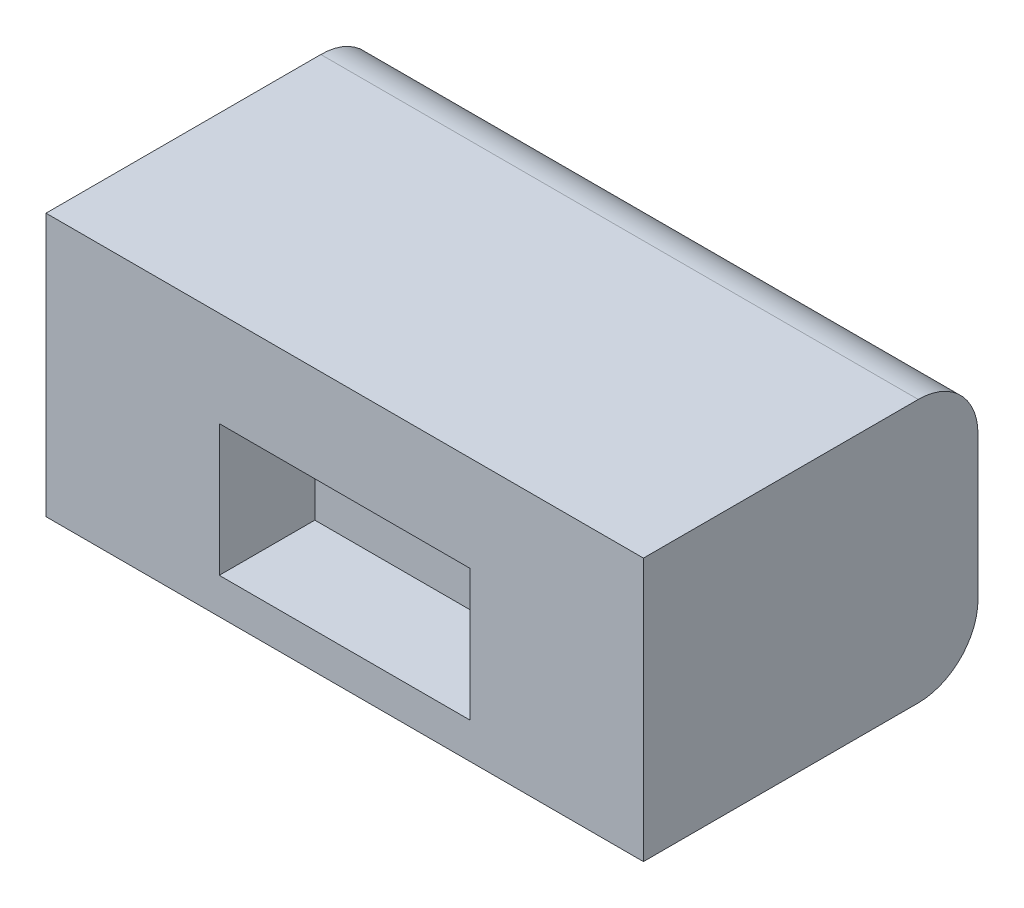
ISO-10303-21;
HEADER;
FILE_DESCRIPTION(('STEP AP214'),'2;1');
FILE_NAME('part.step','',(''),(''),'','','');
FILE_SCHEMA(('AUTOMOTIVE_DESIGN { 1 0 10303 214 1 1 1 1 }'));
ENDSEC;
DATA;
#1=APPLICATION_CONTEXT('core data for automotive mechanical design processes');
#2=APPLICATION_PROTOCOL_DEFINITION('international standard','automotive_design',2000,#1);
#3=PRODUCT_CONTEXT('',#1,'mechanical');
#4=PRODUCT('Part','Part','',(#3));
#5=PRODUCT_RELATED_PRODUCT_CATEGORY('part','',(#4));
#6=PRODUCT_DEFINITION_FORMATION('','',#4);
#7=PRODUCT_DEFINITION_CONTEXT('part definition',#1,'design');
#8=PRODUCT_DEFINITION('design','',#6,#7);
#9=PRODUCT_DEFINITION_SHAPE('','',#8);
#10=(LENGTH_UNIT() NAMED_UNIT(*) SI_UNIT(.MILLI.,.METRE.));
#11=(NAMED_UNIT(*) PLANE_ANGLE_UNIT() SI_UNIT($,.RADIAN.));
#12=(NAMED_UNIT(*) SI_UNIT($,.STERADIAN.) SOLID_ANGLE_UNIT());
#13=UNCERTAINTY_MEASURE_WITH_UNIT(LENGTH_MEASURE(1.E-05),#10,'distance_accuracy_value','');
#14=(GEOMETRIC_REPRESENTATION_CONTEXT(3) GLOBAL_UNCERTAINTY_ASSIGNED_CONTEXT((#13)) GLOBAL_UNIT_ASSIGNED_CONTEXT((#10,
#11,#12)) REPRESENTATION_CONTEXT('',''));
#15=CARTESIAN_POINT('',(0.,0.,0.));
#16=DIRECTION('',(0.,0.,1.));
#17=DIRECTION('',(1.,0.,0.));
#18=AXIS2_PLACEMENT_3D('',#15,#16,#17);
#19=CARTESIAN_POINT('',(2.5,1.1,2.8));
#20=DIRECTION('',(-1.,0.,0.));
#21=DIRECTION('',(0.,-1.,0.));
#22=AXIS2_PLACEMENT_3D('',#19,#20,#21);
#23=PLANE('',#22);
#24=DIRECTION('',(0.,0.,-1.));
#25=VECTOR('',#24,1.);
#26=CARTESIAN_POINT('',(2.5,-1.1,2.8));
#27=LINE('',#26,#25);
#28=CARTESIAN_POINT('',(2.5,-1.1,2.8));
#29=VERTEX_POINT('',#28);
#30=CARTESIAN_POINT('',(2.5,-1.1,0.5));
#31=VERTEX_POINT('',#30);
#32=EDGE_CURVE('E165',#29,#31,#27,.T.);
#33=ORIENTED_EDGE('',*,*,#32,.T.);
#34=CARTESIAN_POINT('',(2.5,-0.6,0.5));
#35=DIRECTION('',(-1.,0.,0.));
#36=DIRECTION('',(0.,-1.,0.));
#37=AXIS2_PLACEMENT_3D('',#34,#35,#36);
#38=CIRCLE('',#37,0.5);
#39=CARTESIAN_POINT('',(2.5,-0.6,0.));
#40=VERTEX_POINT('',#39);
#41=EDGE_CURVE('E185',#31,#40,#38,.F.);
#42=ORIENTED_EDGE('',*,*,#41,.T.);
#43=DIRECTION('',(0.,1.,0.));
#44=VECTOR('',#43,1.);
#45=CARTESIAN_POINT('',(2.5,1.1,0.));
#46=LINE('',#45,#44);
#47=CARTESIAN_POINT('',(2.5,0.6,0.));
#48=VERTEX_POINT('',#47);
#49=EDGE_CURVE('E151',#40,#48,#46,.T.);
#50=ORIENTED_EDGE('',*,*,#49,.T.);
#51=CARTESIAN_POINT('',(2.5,0.6,0.5));
#52=DIRECTION('',(-1.,0.,0.));
#53=DIRECTION('',(0.,-1.,0.));
#54=AXIS2_PLACEMENT_3D('',#51,#52,#53);
#55=CIRCLE('',#54,0.5);
#56=CARTESIAN_POINT('',(2.5,1.1,0.5));
#57=VERTEX_POINT('',#56);
#58=EDGE_CURVE('E183',#48,#57,#55,.F.);
#59=ORIENTED_EDGE('',*,*,#58,.T.);
#60=DIRECTION('',(0.,0.,-1.));
#61=VECTOR('',#60,1.);
#62=CARTESIAN_POINT('',(2.5,1.1,2.8));
#63=LINE('',#62,#61);
#64=CARTESIAN_POINT('',(2.5,1.1,2.8));
#65=VERTEX_POINT('',#64);
#66=EDGE_CURVE('E177',#65,#57,#63,.T.);
#67=ORIENTED_EDGE('',*,*,#66,.F.);
#68=DIRECTION('',(0.,1.,0.));
#69=VECTOR('',#68,1.);
#70=CARTESIAN_POINT('',(2.5,1.1,2.8));
#71=LINE('',#70,#69);
#72=EDGE_CURVE('E155',#29,#65,#71,.T.);
#73=ORIENTED_EDGE('',*,*,#72,.F.);
#74=EDGE_LOOP('',(#33,#42,#50,#59,#67,#73));
#75=FACE_BOUND('',#74,.T.);
#76=ADVANCED_FACE('F33',(#75),#23,.F.);
#77=CARTESIAN_POINT('',(-2.5,1.1,2.8));
#78=DIRECTION('',(0.,-1.,0.));
#79=DIRECTION('',(1.,0.,0.));
#80=AXIS2_PLACEMENT_3D('',#77,#78,#79);
#81=PLANE('',#80);
#82=ORIENTED_EDGE('',*,*,#66,.T.);
#83=DIRECTION('',(-1.,0.,0.));
#84=VECTOR('',#83,1.);
#85=CARTESIAN_POINT('',(-2.5,1.1,0.5));
#86=LINE('',#85,#84);
#87=CARTESIAN_POINT('',(-2.5,1.1,0.5));
#88=VERTEX_POINT('',#87);
#89=EDGE_CURVE('E11',#57,#88,#86,.T.);
#90=ORIENTED_EDGE('',*,*,#89,.T.);
#91=DIRECTION('',(0.,0.,-1.));
#92=VECTOR('',#91,1.);
#93=CARTESIAN_POINT('',(-2.5,1.1,2.8));
#94=LINE('',#93,#92);
#95=CARTESIAN_POINT('',(-2.5,1.1,2.8));
#96=VERTEX_POINT('',#95);
#97=EDGE_CURVE('E174',#96,#88,#94,.T.);
#98=ORIENTED_EDGE('',*,*,#97,.F.);
#99=DIRECTION('',(-1.,0.,0.));
#100=VECTOR('',#99,1.);
#101=CARTESIAN_POINT('',(-2.5,1.1,2.8));
#102=LINE('',#101,#100);
#103=EDGE_CURVE('E158',#65,#96,#102,.T.);
#104=ORIENTED_EDGE('',*,*,#103,.F.);
#105=EDGE_LOOP('',(#82,#90,#98,#104));
#106=FACE_BOUND('',#105,.T.);
#107=ADVANCED_FACE('F208',(#106),#81,.F.);
#108=CARTESIAN_POINT('',(-2.5,1.1,2.8));
#109=DIRECTION('',(1.,0.,0.));
#110=DIRECTION('',(0.,1.,0.));
#111=AXIS2_PLACEMENT_3D('',#108,#109,#110);
#112=PLANE('',#111);
#113=DIRECTION('',(0.,-1.,0.));
#114=VECTOR('',#113,1.);
#115=CARTESIAN_POINT('',(-2.5,1.1,0.));
#116=LINE('',#115,#114);
#117=CARTESIAN_POINT('',(-2.5,0.6,0.));
#118=VERTEX_POINT('',#117);
#119=CARTESIAN_POINT('',(-2.5,-0.6,0.));
#120=VERTEX_POINT('',#119);
#121=EDGE_CURVE('E159',#118,#120,#116,.T.);
#122=ORIENTED_EDGE('',*,*,#121,.T.);
#123=CARTESIAN_POINT('',(-2.5,-0.6,0.5));
#124=DIRECTION('',(1.,0.,0.));
#125=DIRECTION('',(0.,1.,0.));
#126=AXIS2_PLACEMENT_3D('',#123,#124,#125);
#127=CIRCLE('',#126,0.5);
#128=CARTESIAN_POINT('',(-2.5,-1.1,0.5));
#129=VERTEX_POINT('',#128);
#130=EDGE_CURVE('E41',#120,#129,#127,.F.);
#131=ORIENTED_EDGE('',*,*,#130,.T.);
#132=DIRECTION('',(0.,0.,-1.));
#133=VECTOR('',#132,1.);
#134=CARTESIAN_POINT('',(-2.5,-1.1,2.8));
#135=LINE('',#134,#133);
#136=CARTESIAN_POINT('',(-2.5,-1.1,2.8));
#137=VERTEX_POINT('',#136);
#138=EDGE_CURVE('E171',#137,#129,#135,.T.);
#139=ORIENTED_EDGE('',*,*,#138,.F.);
#140=DIRECTION('',(0.,-1.,0.));
#141=VECTOR('',#140,1.);
#142=CARTESIAN_POINT('',(-2.5,1.1,2.8));
#143=LINE('',#142,#141);
#144=EDGE_CURVE('E161',#96,#137,#143,.T.);
#145=ORIENTED_EDGE('',*,*,#144,.F.);
#146=ORIENTED_EDGE('',*,*,#97,.T.);
#147=CARTESIAN_POINT('',(-2.5,0.6,0.5));
#148=DIRECTION('',(1.,0.,0.));
#149=DIRECTION('',(0.,1.,0.));
#150=AXIS2_PLACEMENT_3D('',#147,#148,#149);
#151=CIRCLE('',#150,0.5);
#152=EDGE_CURVE('E48',#88,#118,#151,.F.);
#153=ORIENTED_EDGE('',*,*,#152,.T.);
#154=EDGE_LOOP('',(#122,#131,#139,#145,#146,#153));
#155=FACE_BOUND('',#154,.T.);
#156=ADVANCED_FACE('F193',(#155),#112,.F.);
#157=CARTESIAN_POINT('',(-2.5,-1.1,2.8));
#158=DIRECTION('',(0.,1.,0.));
#159=DIRECTION('',(0.,0.,1.));
#160=AXIS2_PLACEMENT_3D('',#157,#158,#159);
#161=PLANE('',#160);
#162=ORIENTED_EDGE('',*,*,#138,.T.);
#163=DIRECTION('',(1.,0.,0.));
#164=VECTOR('',#163,1.);
#165=CARTESIAN_POINT('',(-2.5,-1.1,0.5));
#166=LINE('',#165,#164);
#167=EDGE_CURVE('E180',#129,#31,#166,.T.);
#168=ORIENTED_EDGE('',*,*,#167,.T.);
#169=ORIENTED_EDGE('',*,*,#32,.F.);
#170=DIRECTION('',(1.,0.,0.));
#171=VECTOR('',#170,1.);
#172=CARTESIAN_POINT('',(-2.5,-1.1,2.8));
#173=LINE('',#172,#171);
#174=EDGE_CURVE('E163',#137,#29,#173,.T.);
#175=ORIENTED_EDGE('',*,*,#174,.F.);
#176=EDGE_LOOP('',(#162,#168,#169,#175));
#177=FACE_BOUND('',#176,.T.);
#178=ADVANCED_FACE('F199',(#177),#161,.F.);
#179=CARTESIAN_POINT('',(0.,0.,2.8));
#180=DIRECTION('',(0.,0.,1.));
#181=DIRECTION('',(1.,0.,0.));
#182=AXIS2_PLACEMENT_3D('',#179,#180,#181);
#183=PLANE('',#182);
#184=DIRECTION('',(0.,1.,0.));
#185=VECTOR('',#184,1.);
#186=CARTESIAN_POINT('',(1.05,0.3,2.8));
#187=LINE('',#186,#185);
#188=CARTESIAN_POINT('',(1.05,-0.8,2.8));
#189=VERTEX_POINT('',#188);
#190=CARTESIAN_POINT('',(1.05,0.3,2.8));
#191=VERTEX_POINT('',#190);
#192=EDGE_CURVE('E119',#189,#191,#187,.T.);
#193=ORIENTED_EDGE('',*,*,#192,.F.);
#194=DIRECTION('',(1.,0.,0.));
#195=VECTOR('',#194,1.);
#196=CARTESIAN_POINT('',(-1.05,-0.8,2.8));
#197=LINE('',#196,#195);
#198=CARTESIAN_POINT('',(-1.05,-0.8,2.8));
#199=VERTEX_POINT('',#198);
#200=EDGE_CURVE('E136',#199,#189,#197,.T.);
#201=ORIENTED_EDGE('',*,*,#200,.F.);
#202=DIRECTION('',(0.,-1.,0.));
#203=VECTOR('',#202,1.);
#204=CARTESIAN_POINT('',(-1.05,0.3,2.8));
#205=LINE('',#204,#203);
#206=CARTESIAN_POINT('',(-1.05,0.3,2.8));
#207=VERTEX_POINT('',#206);
#208=EDGE_CURVE('E139',#207,#199,#205,.T.);
#209=ORIENTED_EDGE('',*,*,#208,.F.);
#210=DIRECTION('',(-1.,0.,0.));
#211=VECTOR('',#210,1.);
#212=CARTESIAN_POINT('',(-1.05,0.3,2.8));
#213=LINE('',#212,#211);
#214=EDGE_CURVE('E145',#191,#207,#213,.T.);
#215=ORIENTED_EDGE('',*,*,#214,.F.);
#216=EDGE_LOOP('',(#193,#201,#209,#215));
#217=FACE_BOUND('',#216,.T.);
#218=ORIENTED_EDGE('',*,*,#72,.T.);
#219=ORIENTED_EDGE('',*,*,#103,.T.);
#220=ORIENTED_EDGE('',*,*,#144,.T.);
#221=ORIENTED_EDGE('',*,*,#174,.T.);
#222=EDGE_LOOP('',(#218,#219,#220,#221));
#223=FACE_BOUND('',#222,.T.);
#224=ADVANCED_FACE('F211',(#217,#223),#183,.T.);
#225=CARTESIAN_POINT('',(0.,0.,0.));
#226=DIRECTION('',(0.,0.,1.));
#227=DIRECTION('',(1.,0.,0.));
#228=AXIS2_PLACEMENT_3D('',#225,#226,#227);
#229=PLANE('',#228);
#230=ORIENTED_EDGE('',*,*,#49,.F.);
#231=DIRECTION('',(1.,0.,0.));
#232=VECTOR('',#231,1.);
#233=CARTESIAN_POINT('',(0.,-0.6,0.));
#234=LINE('',#233,#232);
#235=EDGE_CURVE('E55',#40,#120,#234,.F.);
#236=ORIENTED_EDGE('',*,*,#235,.T.);
#237=ORIENTED_EDGE('',*,*,#121,.F.);
#238=DIRECTION('',(-1.,0.,0.));
#239=VECTOR('',#238,1.);
#240=CARTESIAN_POINT('',(0.,0.6,0.));
#241=LINE('',#240,#239);
#242=EDGE_CURVE('E187',#118,#48,#241,.F.);
#243=ORIENTED_EDGE('',*,*,#242,.T.);
#244=EDGE_LOOP('',(#230,#236,#237,#243));
#245=FACE_BOUND('',#244,.T.);
#246=ADVANCED_FACE('F205',(#245),#229,.F.);
#247=CARTESIAN_POINT('',(1.05,0.3,2.));
#248=DIRECTION('',(1.,0.,0.));
#249=DIRECTION('',(0.,1.,0.));
#250=AXIS2_PLACEMENT_3D('',#247,#248,#249);
#251=PLANE('',#250);
#252=ORIENTED_EDGE('',*,*,#192,.T.);
#253=DIRECTION('',(0.,0.,1.));
#254=VECTOR('',#253,1.);
#255=CARTESIAN_POINT('',(1.05,0.3,2.));
#256=LINE('',#255,#254);
#257=CARTESIAN_POINT('',(1.05,0.3,2.));
#258=VERTEX_POINT('',#257);
#259=EDGE_CURVE('E112',#258,#191,#256,.T.);
#260=ORIENTED_EDGE('',*,*,#259,.F.);
#261=DIRECTION('',(0.,1.,0.));
#262=VECTOR('',#261,1.);
#263=CARTESIAN_POINT('',(1.05,0.3,2.));
#264=LINE('',#263,#262);
#265=CARTESIAN_POINT('',(1.05,-0.8,2.));
#266=VERTEX_POINT('',#265);
#267=EDGE_CURVE('E116',#266,#258,#264,.T.);
#268=ORIENTED_EDGE('',*,*,#267,.F.);
#269=DIRECTION('',(0.,0.,1.));
#270=VECTOR('',#269,1.);
#271=CARTESIAN_POINT('',(1.05,-0.8,2.));
#272=LINE('',#271,#270);
#273=EDGE_CURVE('E149',#266,#189,#272,.T.);
#274=ORIENTED_EDGE('',*,*,#273,.T.);
#275=EDGE_LOOP('',(#252,#260,#268,#274));
#276=FACE_BOUND('',#275,.T.);
#277=ADVANCED_FACE('F114',(#276),#251,.F.);
#278=CARTESIAN_POINT('',(-1.05,-0.8,2.));
#279=DIRECTION('',(0.,-1.,0.));
#280=DIRECTION('',(0.,0.,-1.));
#281=AXIS2_PLACEMENT_3D('',#278,#279,#280);
#282=PLANE('',#281);
#283=ORIENTED_EDGE('',*,*,#200,.T.);
#284=ORIENTED_EDGE('',*,*,#273,.F.);
#285=DIRECTION('',(1.,0.,0.));
#286=VECTOR('',#285,1.);
#287=CARTESIAN_POINT('',(-1.05,-0.8,2.));
#288=LINE('',#287,#286);
#289=CARTESIAN_POINT('',(-1.05,-0.8,2.));
#290=VERTEX_POINT('',#289);
#291=EDGE_CURVE('E124',#290,#266,#288,.T.);
#292=ORIENTED_EDGE('',*,*,#291,.F.);
#293=DIRECTION('',(0.,0.,1.));
#294=VECTOR('',#293,1.);
#295=CARTESIAN_POINT('',(-1.05,-0.8,2.));
#296=LINE('',#295,#294);
#297=EDGE_CURVE('E152',#290,#199,#296,.T.);
#298=ORIENTED_EDGE('',*,*,#297,.T.);
#299=EDGE_LOOP('',(#283,#284,#292,#298));
#300=FACE_BOUND('',#299,.T.);
#301=ADVANCED_FACE('F241',(#300),#282,.F.);
#302=CARTESIAN_POINT('',(-1.05,0.3,2.));
#303=DIRECTION('',(-1.,0.,0.));
#304=DIRECTION('',(0.,-1.,0.));
#305=AXIS2_PLACEMENT_3D('',#302,#303,#304);
#306=PLANE('',#305);
#307=ORIENTED_EDGE('',*,*,#208,.T.);
#308=ORIENTED_EDGE('',*,*,#297,.F.);
#309=DIRECTION('',(0.,-1.,0.));
#310=VECTOR('',#309,1.);
#311=CARTESIAN_POINT('',(-1.05,0.3,2.));
#312=LINE('',#311,#310);
#313=CARTESIAN_POINT('',(-1.05,0.3,2.));
#314=VERTEX_POINT('',#313);
#315=EDGE_CURVE('E132',#314,#290,#312,.T.);
#316=ORIENTED_EDGE('',*,*,#315,.F.);
#317=DIRECTION('',(0.,0.,1.));
#318=VECTOR('',#317,1.);
#319=CARTESIAN_POINT('',(-1.05,0.3,2.));
#320=LINE('',#319,#318);
#321=EDGE_CURVE('E123',#314,#207,#320,.T.);
#322=ORIENTED_EDGE('',*,*,#321,.T.);
#323=EDGE_LOOP('',(#307,#308,#316,#322));
#324=FACE_BOUND('',#323,.T.);
#325=ADVANCED_FACE('F238',(#324),#306,.F.);
#326=CARTESIAN_POINT('',(-1.05,0.3,2.));
#327=DIRECTION('',(0.,1.,0.));
#328=DIRECTION('',(0.,0.,1.));
#329=AXIS2_PLACEMENT_3D('',#326,#327,#328);
#330=PLANE('',#329);
#331=ORIENTED_EDGE('',*,*,#214,.T.);
#332=ORIENTED_EDGE('',*,*,#321,.F.);
#333=DIRECTION('',(-1.,0.,0.));
#334=VECTOR('',#333,1.);
#335=CARTESIAN_POINT('',(-1.05,0.3,2.));
#336=LINE('',#335,#334);
#337=EDGE_CURVE('E127',#258,#314,#336,.T.);
#338=ORIENTED_EDGE('',*,*,#337,.F.);
#339=ORIENTED_EDGE('',*,*,#259,.T.);
#340=EDGE_LOOP('',(#331,#332,#338,#339));
#341=FACE_BOUND('',#340,.T.);
#342=ADVANCED_FACE('F128',(#341),#330,.F.);
#343=CARTESIAN_POINT('',(0.,0.,2.));
#344=DIRECTION('',(0.,0.,1.));
#345=DIRECTION('',(1.,0.,0.));
#346=AXIS2_PLACEMENT_3D('',#343,#344,#345);
#347=PLANE('',#346);
#348=ORIENTED_EDGE('',*,*,#267,.T.);
#349=ORIENTED_EDGE('',*,*,#337,.T.);
#350=ORIENTED_EDGE('',*,*,#315,.T.);
#351=ORIENTED_EDGE('',*,*,#291,.T.);
#352=EDGE_LOOP('',(#348,#349,#350,#351));
#353=FACE_BOUND('',#352,.T.);
#354=ADVANCED_FACE('F134',(#353),#347,.T.);
#355=CARTESIAN_POINT('',(-2.5,-0.6,0.5));
#356=DIRECTION('',(1.,0.,0.));
#357=DIRECTION('',(0.,0.,-1.));
#358=AXIS2_PLACEMENT_3D('',#355,#356,#357);
#359=CYLINDRICAL_SURFACE('',#358,0.5);
#360=ORIENTED_EDGE('',*,*,#130,.F.);
#361=ORIENTED_EDGE('',*,*,#235,.F.);
#362=ORIENTED_EDGE('',*,*,#41,.F.);
#363=ORIENTED_EDGE('',*,*,#167,.F.);
#364=EDGE_LOOP('',(#360,#361,#362,#363));
#365=FACE_BOUND('',#364,.T.);
#366=ADVANCED_FACE('F201',(#365),#359,.T.);
#367=CARTESIAN_POINT('',(-2.5,0.6,0.5));
#368=DIRECTION('',(-1.,0.,0.));
#369=DIRECTION('',(0.,-1.,0.));
#370=AXIS2_PLACEMENT_3D('',#367,#368,#369);
#371=CYLINDRICAL_SURFACE('',#370,0.5);
#372=ORIENTED_EDGE('',*,*,#58,.F.);
#373=ORIENTED_EDGE('',*,*,#242,.F.);
#374=ORIENTED_EDGE('',*,*,#152,.F.);
#375=ORIENTED_EDGE('',*,*,#89,.F.);
#376=EDGE_LOOP('',(#372,#373,#374,#375));
#377=FACE_BOUND('',#376,.T.);
#378=ADVANCED_FACE('F35',(#377),#371,.T.);
#379=CLOSED_SHELL('',(#76,#107,#156,#178,#224,#246,#277,#301,#325,#342,#354,#366,#378));
#380=MANIFOLD_SOLID_BREP('B2',#379);
#381=ADVANCED_BREP_SHAPE_REPRESENTATION('',(#18,#380),#14);
#382=SHAPE_DEFINITION_REPRESENTATION(#9,#381);
ENDSEC;
END-ISO-10303-21;
